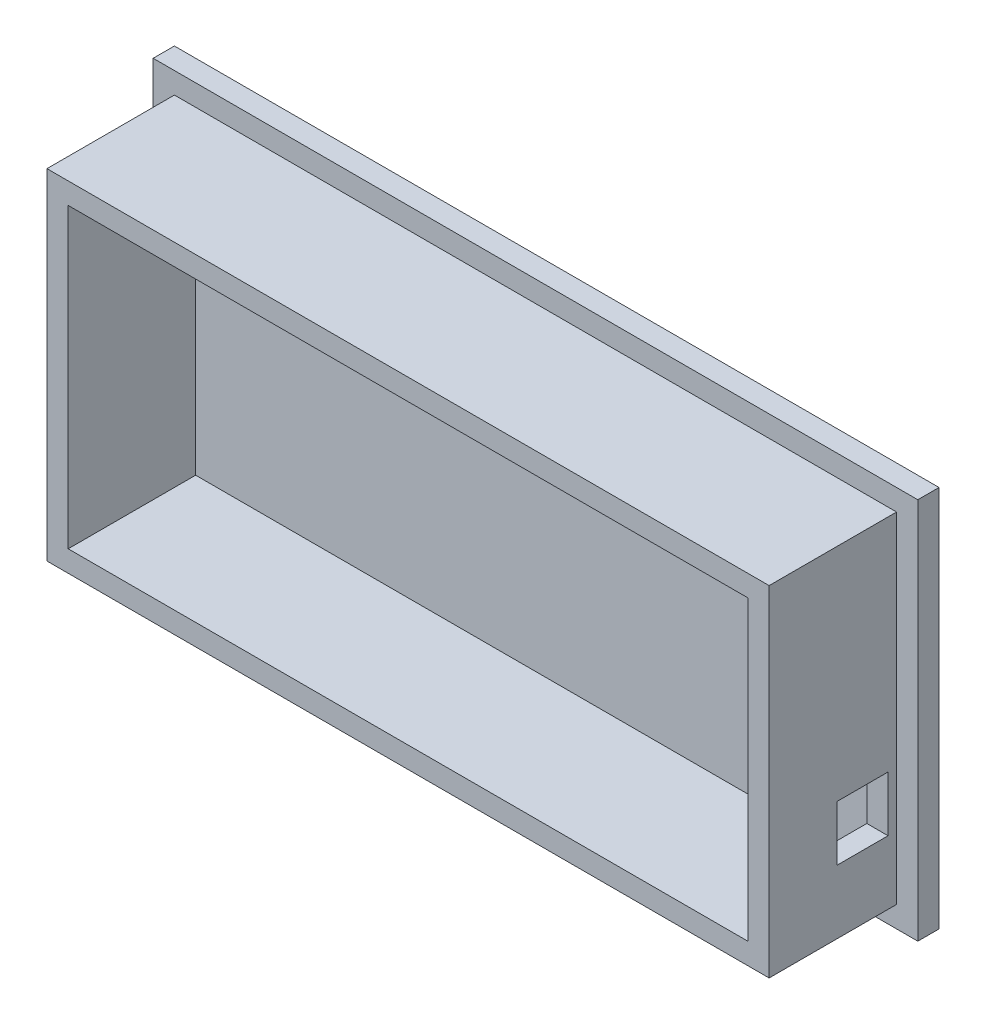
ISO-10303-21;
HEADER;
FILE_DESCRIPTION(('STEP AP214'),'2;1');
FILE_NAME('part.step','',(''),(''),'','','');
FILE_SCHEMA(('AUTOMOTIVE_DESIGN { 1 0 10303 214 1 1 1 1 }'));
ENDSEC;
DATA;
#1=APPLICATION_CONTEXT('core data for automotive mechanical design processes');
#2=APPLICATION_PROTOCOL_DEFINITION('international standard','automotive_design',2000,#1);
#3=PRODUCT_CONTEXT('',#1,'mechanical');
#4=PRODUCT('Part','Part','',(#3));
#5=PRODUCT_RELATED_PRODUCT_CATEGORY('part','',(#4));
#6=PRODUCT_DEFINITION_FORMATION('','',#4);
#7=PRODUCT_DEFINITION_CONTEXT('part definition',#1,'design');
#8=PRODUCT_DEFINITION('design','',#6,#7);
#9=PRODUCT_DEFINITION_SHAPE('','',#8);
#10=(LENGTH_UNIT() NAMED_UNIT(*) SI_UNIT(.MILLI.,.METRE.));
#11=(NAMED_UNIT(*) PLANE_ANGLE_UNIT() SI_UNIT($,.RADIAN.));
#12=(NAMED_UNIT(*) SI_UNIT($,.STERADIAN.) SOLID_ANGLE_UNIT());
#13=UNCERTAINTY_MEASURE_WITH_UNIT(LENGTH_MEASURE(1.E-05),#10,'distance_accuracy_value','');
#14=(GEOMETRIC_REPRESENTATION_CONTEXT(3) GLOBAL_UNCERTAINTY_ASSIGNED_CONTEXT((#13)) GLOBAL_UNIT_ASSIGNED_CONTEXT((#10,
#11,#12)) REPRESENTATION_CONTEXT('',''));
#15=CARTESIAN_POINT('',(0.,0.,0.));
#16=DIRECTION('',(0.,0.,1.));
#17=DIRECTION('',(1.,0.,0.));
#18=AXIS2_PLACEMENT_3D('',#15,#16,#17);
#19=CARTESIAN_POINT('',(0.,0.,5.));
#20=DIRECTION('',(0.,0.,-1.));
#21=DIRECTION('',(-1.,0.,0.));
#22=AXIS2_PLACEMENT_3D('',#19,#20,#21);
#23=PLANE('',#22);
#24=DIRECTION('',(0.,-1.,0.));
#25=VECTOR('',#24,1.);
#26=CARTESIAN_POINT('',(0.,0.,5.));
#27=LINE('',#26,#25);
#28=CARTESIAN_POINT('',(0.,90.,5.));
#29=VERTEX_POINT('',#28);
#30=CARTESIAN_POINT('',(0.,0.,5.));
#31=VERTEX_POINT('',#30);
#32=EDGE_CURVE('E290',#29,#31,#27,.T.);
#33=ORIENTED_EDGE('',*,*,#32,.T.);
#34=DIRECTION('',(1.,0.,0.));
#35=VECTOR('',#34,1.);
#36=CARTESIAN_POINT('',(0.,0.,5.));
#37=LINE('',#36,#35);
#38=CARTESIAN_POINT('',(180.,0.,5.));
#39=VERTEX_POINT('',#38);
#40=EDGE_CURVE('E294',#31,#39,#37,.T.);
#41=ORIENTED_EDGE('',*,*,#40,.T.);
#42=DIRECTION('',(0.,1.,0.));
#43=VECTOR('',#42,1.);
#44=CARTESIAN_POINT('',(180.,0.,5.));
#45=LINE('',#44,#43);
#46=CARTESIAN_POINT('',(180.,90.,5.));
#47=VERTEX_POINT('',#46);
#48=EDGE_CURVE('E298',#39,#47,#45,.T.);
#49=ORIENTED_EDGE('',*,*,#48,.T.);
#50=DIRECTION('',(-1.,0.,0.));
#51=VECTOR('',#50,1.);
#52=CARTESIAN_POINT('',(0.,90.,5.));
#53=LINE('',#52,#51);
#54=EDGE_CURVE('E301',#47,#29,#53,.T.);
#55=ORIENTED_EDGE('',*,*,#54,.T.);
#56=EDGE_LOOP('',(#33,#41,#49,#55));
#57=FACE_BOUND('',#56,.T.);
#58=DIRECTION('',(-1.,0.,0.));
#59=VECTOR('',#58,1.);
#60=CARTESIAN_POINT('',(175.,85.,5.));
#61=LINE('',#60,#59);
#62=CARTESIAN_POINT('',(175.,85.,5.));
#63=VERTEX_POINT('',#62);
#64=CARTESIAN_POINT('',(5.,85.,5.));
#65=VERTEX_POINT('',#64);
#66=EDGE_CURVE('E244',#63,#65,#61,.T.);
#67=ORIENTED_EDGE('',*,*,#66,.F.);
#68=DIRECTION('',(0.,1.,0.));
#69=VECTOR('',#68,1.);
#70=CARTESIAN_POINT('',(175.,5.,5.));
#71=LINE('',#70,#69);
#72=CARTESIAN_POINT('',(175.,5.,5.));
#73=VERTEX_POINT('',#72);
#74=EDGE_CURVE('E250',#73,#63,#71,.T.);
#75=ORIENTED_EDGE('',*,*,#74,.F.);
#76=DIRECTION('',(1.,0.,0.));
#77=VECTOR('',#76,1.);
#78=CARTESIAN_POINT('',(5.,5.,5.));
#79=LINE('',#78,#77);
#80=CARTESIAN_POINT('',(5.,5.,5.));
#81=VERTEX_POINT('',#80);
#82=EDGE_CURVE('E267',#81,#73,#79,.T.);
#83=ORIENTED_EDGE('',*,*,#82,.F.);
#84=DIRECTION('',(0.,-1.,0.));
#85=VECTOR('',#84,1.);
#86=CARTESIAN_POINT('',(5.,85.,5.));
#87=LINE('',#86,#85);
#88=EDGE_CURVE('E263',#65,#81,#87,.T.);
#89=ORIENTED_EDGE('',*,*,#88,.F.);
#90=EDGE_LOOP('',(#67,#75,#83,#89));
#91=FACE_BOUND('',#90,.T.);
#92=ADVANCED_FACE('F42',(#57,#91),#23,.F.);
#93=CARTESIAN_POINT('',(0.,0.,5.));
#94=DIRECTION('',(1.,0.,0.));
#95=DIRECTION('',(0.,0.,-1.));
#96=AXIS2_PLACEMENT_3D('',#93,#94,#95);
#97=PLANE('',#96);
#98=DIRECTION('',(0.,-1.,0.));
#99=VECTOR('',#98,1.);
#100=CARTESIAN_POINT('',(0.,0.,0.));
#101=LINE('',#100,#99);
#102=CARTESIAN_POINT('',(0.,90.,0.));
#103=VERTEX_POINT('',#102);
#104=CARTESIAN_POINT('',(0.,0.,0.));
#105=VERTEX_POINT('',#104);
#106=EDGE_CURVE('E289',#103,#105,#101,.T.);
#107=ORIENTED_EDGE('',*,*,#106,.T.);
#108=DIRECTION('',(0.,0.,-1.));
#109=VECTOR('',#108,1.);
#110=CARTESIAN_POINT('',(0.,0.,5.));
#111=LINE('',#110,#109);
#112=EDGE_CURVE('E11',#31,#105,#111,.T.);
#113=ORIENTED_EDGE('',*,*,#112,.F.);
#114=ORIENTED_EDGE('',*,*,#32,.F.);
#115=DIRECTION('',(0.,0.,-1.));
#116=VECTOR('',#115,1.);
#117=CARTESIAN_POINT('',(0.,90.,5.));
#118=LINE('',#117,#116);
#119=EDGE_CURVE('E304',#29,#103,#118,.T.);
#120=ORIENTED_EDGE('',*,*,#119,.T.);
#121=EDGE_LOOP('',(#107,#113,#114,#120));
#122=FACE_BOUND('',#121,.T.);
#123=ADVANCED_FACE('F44',(#122),#97,.F.);
#124=CARTESIAN_POINT('',(0.,0.,5.));
#125=DIRECTION('',(0.,1.,0.));
#126=DIRECTION('',(0.,0.,1.));
#127=AXIS2_PLACEMENT_3D('',#124,#125,#126);
#128=PLANE('',#127);
#129=DIRECTION('',(1.,0.,0.));
#130=VECTOR('',#129,1.);
#131=CARTESIAN_POINT('',(0.,0.,0.));
#132=LINE('',#131,#130);
#133=CARTESIAN_POINT('',(180.,0.,0.));
#134=VERTEX_POINT('',#133);
#135=EDGE_CURVE('E308',#105,#134,#132,.T.);
#136=ORIENTED_EDGE('',*,*,#135,.T.);
#137=DIRECTION('',(0.,0.,-1.));
#138=VECTOR('',#137,1.);
#139=CARTESIAN_POINT('',(180.,0.,5.));
#140=LINE('',#139,#138);
#141=EDGE_CURVE('E51',#39,#134,#140,.T.);
#142=ORIENTED_EDGE('',*,*,#141,.F.);
#143=ORIENTED_EDGE('',*,*,#40,.F.);
#144=ORIENTED_EDGE('',*,*,#112,.T.);
#145=EDGE_LOOP('',(#136,#142,#143,#144));
#146=FACE_BOUND('',#145,.T.);
#147=ADVANCED_FACE('F344',(#146),#128,.F.);
#148=CARTESIAN_POINT('',(180.,0.,5.));
#149=DIRECTION('',(-1.,0.,0.));
#150=DIRECTION('',(0.,0.,1.));
#151=AXIS2_PLACEMENT_3D('',#148,#149,#150);
#152=PLANE('',#151);
#153=DIRECTION('',(0.,1.,0.));
#154=VECTOR('',#153,1.);
#155=CARTESIAN_POINT('',(180.,0.,0.));
#156=LINE('',#155,#154);
#157=CARTESIAN_POINT('',(180.,90.,0.));
#158=VERTEX_POINT('',#157);
#159=EDGE_CURVE('E311',#134,#158,#156,.T.);
#160=ORIENTED_EDGE('',*,*,#159,.T.);
#161=DIRECTION('',(0.,0.,-1.));
#162=VECTOR('',#161,1.);
#163=CARTESIAN_POINT('',(180.,90.,5.));
#164=LINE('',#163,#162);
#165=EDGE_CURVE('E319',#47,#158,#164,.T.);
#166=ORIENTED_EDGE('',*,*,#165,.F.);
#167=ORIENTED_EDGE('',*,*,#48,.F.);
#168=ORIENTED_EDGE('',*,*,#141,.T.);
#169=EDGE_LOOP('',(#160,#166,#167,#168));
#170=FACE_BOUND('',#169,.T.);
#171=ADVANCED_FACE('F328',(#170),#152,.F.);
#172=CARTESIAN_POINT('',(0.,90.,5.));
#173=DIRECTION('',(0.,-1.,0.));
#174=DIRECTION('',(0.,0.,-1.));
#175=AXIS2_PLACEMENT_3D('',#172,#173,#174);
#176=PLANE('',#175);
#177=DIRECTION('',(-1.,0.,0.));
#178=VECTOR('',#177,1.);
#179=CARTESIAN_POINT('',(0.,90.,0.));
#180=LINE('',#179,#178);
#181=EDGE_CURVE('E295',#158,#103,#180,.T.);
#182=ORIENTED_EDGE('',*,*,#181,.T.);
#183=ORIENTED_EDGE('',*,*,#119,.F.);
#184=ORIENTED_EDGE('',*,*,#54,.F.);
#185=ORIENTED_EDGE('',*,*,#165,.T.);
#186=EDGE_LOOP('',(#182,#183,#184,#185));
#187=FACE_BOUND('',#186,.T.);
#188=ADVANCED_FACE('F337',(#187),#176,.F.);
#189=CARTESIAN_POINT('',(0.,0.,0.));
#190=DIRECTION('',(0.,0.,-1.));
#191=DIRECTION('',(-1.,0.,0.));
#192=AXIS2_PLACEMENT_3D('',#189,#190,#191);
#193=PLANE('',#192);
#194=ORIENTED_EDGE('',*,*,#106,.F.);
#195=ORIENTED_EDGE('',*,*,#181,.F.);
#196=ORIENTED_EDGE('',*,*,#159,.F.);
#197=ORIENTED_EDGE('',*,*,#135,.F.);
#198=EDGE_LOOP('',(#194,#195,#196,#197));
#199=FACE_BOUND('',#198,.T.);
#200=ADVANCED_FACE('F334',(#199),#193,.T.);
#201=CARTESIAN_POINT('',(0.,0.,35.));
#202=DIRECTION('',(0.,0.,1.));
#203=DIRECTION('',(1.,0.,0.));
#204=AXIS2_PLACEMENT_3D('',#201,#202,#203);
#205=PLANE('',#204);
#206=DIRECTION('',(-1.,0.,0.));
#207=VECTOR('',#206,1.);
#208=CARTESIAN_POINT('',(175.,85.,35.));
#209=LINE('',#208,#207);
#210=CARTESIAN_POINT('',(175.,85.,35.));
#211=VERTEX_POINT('',#210);
#212=CARTESIAN_POINT('',(5.,85.,35.));
#213=VERTEX_POINT('',#212);
#214=EDGE_CURVE('E245',#211,#213,#209,.T.);
#215=ORIENTED_EDGE('',*,*,#214,.T.);
#216=DIRECTION('',(0.,-1.,0.));
#217=VECTOR('',#216,1.);
#218=CARTESIAN_POINT('',(5.,85.,35.));
#219=LINE('',#218,#217);
#220=CARTESIAN_POINT('',(5.,5.,35.));
#221=VERTEX_POINT('',#220);
#222=EDGE_CURVE('E249',#213,#221,#219,.T.);
#223=ORIENTED_EDGE('',*,*,#222,.T.);
#224=DIRECTION('',(1.,0.,0.));
#225=VECTOR('',#224,1.);
#226=CARTESIAN_POINT('',(5.,5.,35.));
#227=LINE('',#226,#225);
#228=CARTESIAN_POINT('',(175.,5.,35.));
#229=VERTEX_POINT('',#228);
#230=EDGE_CURVE('E253',#221,#229,#227,.T.);
#231=ORIENTED_EDGE('',*,*,#230,.T.);
#232=DIRECTION('',(0.,1.,0.));
#233=VECTOR('',#232,1.);
#234=CARTESIAN_POINT('',(175.,5.,35.));
#235=LINE('',#234,#233);
#236=EDGE_CURVE('E256',#229,#211,#235,.T.);
#237=ORIENTED_EDGE('',*,*,#236,.T.);
#238=EDGE_LOOP('',(#215,#223,#231,#237));
#239=FACE_BOUND('',#238,.T.);
#240=DIRECTION('',(-1.,0.,0.));
#241=VECTOR('',#240,1.);
#242=CARTESIAN_POINT('',(170.,80.,35.));
#243=LINE('',#242,#241);
#244=CARTESIAN_POINT('',(170.,80.,35.));
#245=VERTEX_POINT('',#244);
#246=CARTESIAN_POINT('',(10.,80.,35.));
#247=VERTEX_POINT('',#246);
#248=EDGE_CURVE('E206',#245,#247,#243,.T.);
#249=ORIENTED_EDGE('',*,*,#248,.F.);
#250=DIRECTION('',(0.,1.,0.));
#251=VECTOR('',#250,1.);
#252=CARTESIAN_POINT('',(170.,10.,35.));
#253=LINE('',#252,#251);
#254=CARTESIAN_POINT('',(170.,10.,35.));
#255=VERTEX_POINT('',#254);
#256=EDGE_CURVE('E203',#255,#245,#253,.T.);
#257=ORIENTED_EDGE('',*,*,#256,.F.);
#258=DIRECTION('',(1.,0.,0.));
#259=VECTOR('',#258,1.);
#260=CARTESIAN_POINT('',(10.,10.,35.));
#261=LINE('',#260,#259);
#262=CARTESIAN_POINT('',(10.,10.,35.));
#263=VERTEX_POINT('',#262);
#264=EDGE_CURVE('E214',#263,#255,#261,.T.);
#265=ORIENTED_EDGE('',*,*,#264,.F.);
#266=DIRECTION('',(0.,-1.,0.));
#267=VECTOR('',#266,1.);
#268=CARTESIAN_POINT('',(10.,80.,35.));
#269=LINE('',#268,#267);
#270=EDGE_CURVE('E210',#247,#263,#269,.T.);
#271=ORIENTED_EDGE('',*,*,#270,.F.);
#272=EDGE_LOOP('',(#249,#257,#265,#271));
#273=FACE_BOUND('',#272,.T.);
#274=ADVANCED_FACE('F382',(#239,#273),#205,.T.);
#275=CARTESIAN_POINT('',(175.,85.,35.));
#276=DIRECTION('',(0.,-1.,0.));
#277=DIRECTION('',(0.,0.,-1.));
#278=AXIS2_PLACEMENT_3D('',#275,#276,#277);
#279=PLANE('',#278);
#280=ORIENTED_EDGE('',*,*,#66,.T.);
#281=DIRECTION('',(0.,0.,-1.));
#282=VECTOR('',#281,1.);
#283=CARTESIAN_POINT('',(5.,85.,35.));
#284=LINE('',#283,#282);
#285=EDGE_CURVE('E285',#213,#65,#284,.T.);
#286=ORIENTED_EDGE('',*,*,#285,.F.);
#287=ORIENTED_EDGE('',*,*,#214,.F.);
#288=DIRECTION('',(0.,0.,-1.));
#289=VECTOR('',#288,1.);
#290=CARTESIAN_POINT('',(175.,85.,35.));
#291=LINE('',#290,#289);
#292=EDGE_CURVE('E259',#211,#63,#291,.T.);
#293=ORIENTED_EDGE('',*,*,#292,.T.);
#294=EDGE_LOOP('',(#280,#286,#287,#293));
#295=FACE_BOUND('',#294,.T.);
#296=ADVANCED_FACE('F396',(#295),#279,.F.);
#297=CARTESIAN_POINT('',(5.,85.,35.));
#298=DIRECTION('',(1.,0.,0.));
#299=DIRECTION('',(0.,0.,-1.));
#300=AXIS2_PLACEMENT_3D('',#297,#298,#299);
#301=PLANE('',#300);
#302=ORIENTED_EDGE('',*,*,#88,.T.);
#303=DIRECTION('',(0.,0.,-1.));
#304=VECTOR('',#303,1.);
#305=CARTESIAN_POINT('',(5.,5.,35.));
#306=LINE('',#305,#304);
#307=EDGE_CURVE('E281',#221,#81,#306,.T.);
#308=ORIENTED_EDGE('',*,*,#307,.F.);
#309=ORIENTED_EDGE('',*,*,#222,.F.);
#310=ORIENTED_EDGE('',*,*,#285,.T.);
#311=EDGE_LOOP('',(#302,#308,#309,#310));
#312=FACE_BOUND('',#311,.T.);
#313=ADVANCED_FACE('F404',(#312),#301,.F.);
#314=CARTESIAN_POINT('',(5.,5.,35.));
#315=DIRECTION('',(0.,1.,0.));
#316=DIRECTION('',(0.,0.,1.));
#317=AXIS2_PLACEMENT_3D('',#314,#315,#316);
#318=PLANE('',#317);
#319=ORIENTED_EDGE('',*,*,#82,.T.);
#320=DIRECTION('',(0.,0.,-1.));
#321=VECTOR('',#320,1.);
#322=CARTESIAN_POINT('',(175.,5.,35.));
#323=LINE('',#322,#321);
#324=EDGE_CURVE('E277',#229,#73,#323,.T.);
#325=ORIENTED_EDGE('',*,*,#324,.F.);
#326=ORIENTED_EDGE('',*,*,#230,.F.);
#327=ORIENTED_EDGE('',*,*,#307,.T.);
#328=EDGE_LOOP('',(#319,#325,#326,#327));
#329=FACE_BOUND('',#328,.T.);
#330=ADVANCED_FACE('F400',(#329),#318,.F.);
#331=CARTESIAN_POINT('',(175.,5.,35.));
#332=DIRECTION('',(-1.,0.,0.));
#333=DIRECTION('',(0.,0.,1.));
#334=AXIS2_PLACEMENT_3D('',#331,#332,#333);
#335=PLANE('',#334);
#336=DIRECTION('',(0.,1.,0.));
#337=VECTOR('',#336,1.);
#338=CARTESIAN_POINT('',(175.,20.,7.));
#339=LINE('',#338,#337);
#340=CARTESIAN_POINT('',(175.,20.,7.));
#341=VERTEX_POINT('',#340);
#342=CARTESIAN_POINT('',(175.,33.,7.));
#343=VERTEX_POINT('',#342);
#344=EDGE_CURVE('E184',#341,#343,#339,.T.);
#345=ORIENTED_EDGE('',*,*,#344,.F.);
#346=DIRECTION('',(0.,0.,-1.));
#347=VECTOR('',#346,1.);
#348=CARTESIAN_POINT('',(175.,20.,19.));
#349=LINE('',#348,#347);
#350=CARTESIAN_POINT('',(175.,20.,19.));
#351=VERTEX_POINT('',#350);
#352=EDGE_CURVE('E174',#351,#341,#349,.T.);
#353=ORIENTED_EDGE('',*,*,#352,.F.);
#354=DIRECTION('',(0.,-1.,0.));
#355=VECTOR('',#354,1.);
#356=CARTESIAN_POINT('',(175.,20.,19.));
#357=LINE('',#356,#355);
#358=CARTESIAN_POINT('',(175.,33.,19.));
#359=VERTEX_POINT('',#358);
#360=EDGE_CURVE('E188',#359,#351,#357,.T.);
#361=ORIENTED_EDGE('',*,*,#360,.F.);
#362=DIRECTION('',(0.,0.,1.));
#363=VECTOR('',#362,1.);
#364=CARTESIAN_POINT('',(175.,33.,19.));
#365=LINE('',#364,#363);
#366=EDGE_CURVE('E58',#343,#359,#365,.T.);
#367=ORIENTED_EDGE('',*,*,#366,.F.);
#368=EDGE_LOOP('',(#345,#353,#361,#367));
#369=FACE_BOUND('',#368,.T.);
#370=ORIENTED_EDGE('',*,*,#74,.T.);
#371=ORIENTED_EDGE('',*,*,#292,.F.);
#372=ORIENTED_EDGE('',*,*,#236,.F.);
#373=ORIENTED_EDGE('',*,*,#324,.T.);
#374=EDGE_LOOP('',(#370,#371,#372,#373));
#375=FACE_BOUND('',#374,.T.);
#376=ADVANCED_FACE('F393',(#369,#375),#335,.F.);
#377=CARTESIAN_POINT('',(170.,10.,35.));
#378=DIRECTION('',(-1.,0.,0.));
#379=DIRECTION('',(0.,0.,1.));
#380=AXIS2_PLACEMENT_3D('',#377,#378,#379);
#381=PLANE('',#380);
#382=DIRECTION('',(0.,0.,-1.));
#383=VECTOR('',#382,1.);
#384=CARTESIAN_POINT('',(170.,20.,19.));
#385=LINE('',#384,#383);
#386=CARTESIAN_POINT('',(170.,20.,19.));
#387=VERTEX_POINT('',#386);
#388=CARTESIAN_POINT('',(170.,20.,7.));
#389=VERTEX_POINT('',#388);
#390=EDGE_CURVE('E171',#387,#389,#385,.T.);
#391=ORIENTED_EDGE('',*,*,#390,.T.);
#392=DIRECTION('',(0.,1.,0.));
#393=VECTOR('',#392,1.);
#394=CARTESIAN_POINT('',(170.,20.,7.));
#395=LINE('',#394,#393);
#396=CARTESIAN_POINT('',(170.,33.,7.));
#397=VERTEX_POINT('',#396);
#398=EDGE_CURVE('E157',#389,#397,#395,.T.);
#399=ORIENTED_EDGE('',*,*,#398,.T.);
#400=DIRECTION('',(0.,0.,1.));
#401=VECTOR('',#400,1.);
#402=CARTESIAN_POINT('',(170.,33.,19.));
#403=LINE('',#402,#401);
#404=CARTESIAN_POINT('',(170.,33.,19.));
#405=VERTEX_POINT('',#404);
#406=EDGE_CURVE('E193',#397,#405,#403,.T.);
#407=ORIENTED_EDGE('',*,*,#406,.T.);
#408=DIRECTION('',(0.,-1.,0.));
#409=VECTOR('',#408,1.);
#410=CARTESIAN_POINT('',(170.,20.,19.));
#411=LINE('',#410,#409);
#412=EDGE_CURVE('E180',#405,#387,#411,.T.);
#413=ORIENTED_EDGE('',*,*,#412,.T.);
#414=EDGE_LOOP('',(#391,#399,#407,#413));
#415=FACE_BOUND('',#414,.T.);
#416=DIRECTION('',(0.,1.,0.));
#417=VECTOR('',#416,1.);
#418=CARTESIAN_POINT('',(170.,10.,5.));
#419=LINE('',#418,#417);
#420=CARTESIAN_POINT('',(170.,10.,5.));
#421=VERTEX_POINT('',#420);
#422=CARTESIAN_POINT('',(170.,80.,5.));
#423=VERTEX_POINT('',#422);
#424=EDGE_CURVE('E202',#421,#423,#419,.T.);
#425=ORIENTED_EDGE('',*,*,#424,.F.);
#426=DIRECTION('',(0.,0.,-1.));
#427=VECTOR('',#426,1.);
#428=CARTESIAN_POINT('',(170.,10.,35.));
#429=LINE('',#428,#427);
#430=EDGE_CURVE('E217',#255,#421,#429,.T.);
#431=ORIENTED_EDGE('',*,*,#430,.F.);
#432=ORIENTED_EDGE('',*,*,#256,.T.);
#433=DIRECTION('',(0.,0.,-1.));
#434=VECTOR('',#433,1.);
#435=CARTESIAN_POINT('',(170.,80.,35.));
#436=LINE('',#435,#434);
#437=EDGE_CURVE('E240',#245,#423,#436,.T.);
#438=ORIENTED_EDGE('',*,*,#437,.T.);
#439=EDGE_LOOP('',(#425,#431,#432,#438));
#440=FACE_BOUND('',#439,.T.);
#441=ADVANCED_FACE('F178',(#415,#440),#381,.T.);
#442=CARTESIAN_POINT('',(170.,80.,35.));
#443=DIRECTION('',(0.,-1.,0.));
#444=DIRECTION('',(0.,0.,-1.));
#445=AXIS2_PLACEMENT_3D('',#442,#443,#444);
#446=PLANE('',#445);
#447=DIRECTION('',(-1.,0.,0.));
#448=VECTOR('',#447,1.);
#449=CARTESIAN_POINT('',(170.,80.,5.));
#450=LINE('',#449,#448);
#451=CARTESIAN_POINT('',(10.,80.,5.));
#452=VERTEX_POINT('',#451);
#453=EDGE_CURVE('E221',#423,#452,#450,.T.);
#454=ORIENTED_EDGE('',*,*,#453,.F.);
#455=ORIENTED_EDGE('',*,*,#437,.F.);
#456=ORIENTED_EDGE('',*,*,#248,.T.);
#457=DIRECTION('',(0.,0.,-1.));
#458=VECTOR('',#457,1.);
#459=CARTESIAN_POINT('',(10.,80.,35.));
#460=LINE('',#459,#458);
#461=EDGE_CURVE('E237',#247,#452,#460,.T.);
#462=ORIENTED_EDGE('',*,*,#461,.T.);
#463=EDGE_LOOP('',(#454,#455,#456,#462));
#464=FACE_BOUND('',#463,.T.);
#465=ADVANCED_FACE('F378',(#464),#446,.T.);
#466=CARTESIAN_POINT('',(10.,80.,35.));
#467=DIRECTION('',(1.,0.,0.));
#468=DIRECTION('',(0.,0.,-1.));
#469=AXIS2_PLACEMENT_3D('',#466,#467,#468);
#470=PLANE('',#469);
#471=DIRECTION('',(0.,-1.,0.));
#472=VECTOR('',#471,1.);
#473=CARTESIAN_POINT('',(10.,80.,5.));
#474=LINE('',#473,#472);
#475=CARTESIAN_POINT('',(10.,10.,5.));
#476=VERTEX_POINT('',#475);
#477=EDGE_CURVE('E225',#452,#476,#474,.T.);
#478=ORIENTED_EDGE('',*,*,#477,.F.);
#479=ORIENTED_EDGE('',*,*,#461,.F.);
#480=ORIENTED_EDGE('',*,*,#270,.T.);
#481=DIRECTION('',(0.,0.,-1.));
#482=VECTOR('',#481,1.);
#483=CARTESIAN_POINT('',(10.,10.,35.));
#484=LINE('',#483,#482);
#485=EDGE_CURVE('E234',#263,#476,#484,.T.);
#486=ORIENTED_EDGE('',*,*,#485,.T.);
#487=EDGE_LOOP('',(#478,#479,#480,#486));
#488=FACE_BOUND('',#487,.T.);
#489=ADVANCED_FACE('F366',(#488),#470,.T.);
#490=CARTESIAN_POINT('',(10.,10.,35.));
#491=DIRECTION('',(0.,1.,0.));
#492=DIRECTION('',(0.,0.,1.));
#493=AXIS2_PLACEMENT_3D('',#490,#491,#492);
#494=PLANE('',#493);
#495=DIRECTION('',(1.,0.,0.));
#496=VECTOR('',#495,1.);
#497=CARTESIAN_POINT('',(10.,10.,5.));
#498=LINE('',#497,#496);
#499=EDGE_CURVE('E207',#476,#421,#498,.T.);
#500=ORIENTED_EDGE('',*,*,#499,.F.);
#501=ORIENTED_EDGE('',*,*,#485,.F.);
#502=ORIENTED_EDGE('',*,*,#264,.T.);
#503=ORIENTED_EDGE('',*,*,#430,.T.);
#504=EDGE_LOOP('',(#500,#501,#502,#503));
#505=FACE_BOUND('',#504,.T.);
#506=ADVANCED_FACE('F359',(#505),#494,.T.);
#507=ORIENTED_EDGE('',*,*,#499,.T.);
#508=ORIENTED_EDGE('',*,*,#424,.T.);
#509=ORIENTED_EDGE('',*,*,#453,.T.);
#510=ORIENTED_EDGE('',*,*,#477,.T.);
#511=EDGE_LOOP('',(#507,#508,#509,#510));
#512=FACE_BOUND('',#511,.T.);
#513=ADVANCED_FACE('F353',(#512),#23,.F.);
#514=CARTESIAN_POINT('',(152.308193987046,20.,19.));
#515=DIRECTION('',(0.,-1.,0.));
#516=DIRECTION('',(0.,0.,-1.));
#517=AXIS2_PLACEMENT_3D('',#514,#515,#516);
#518=PLANE('',#517);
#519=DIRECTION('',(1.,0.,0.));
#520=VECTOR('',#519,1.);
#521=CARTESIAN_POINT('',(152.308193987046,20.,19.));
#522=LINE('',#521,#520);
#523=EDGE_CURVE('E66',#387,#351,#522,.T.);
#524=ORIENTED_EDGE('',*,*,#523,.T.);
#525=ORIENTED_EDGE('',*,*,#352,.T.);
#526=DIRECTION('',(1.,0.,0.));
#527=VECTOR('',#526,1.);
#528=CARTESIAN_POINT('',(152.308193987046,20.,7.));
#529=LINE('',#528,#527);
#530=EDGE_CURVE('E161',#389,#341,#529,.T.);
#531=ORIENTED_EDGE('',*,*,#530,.F.);
#532=ORIENTED_EDGE('',*,*,#390,.F.);
#533=EDGE_LOOP('',(#524,#525,#531,#532));
#534=FACE_BOUND('',#533,.T.);
#535=ADVANCED_FACE('F170',(#534),#518,.F.);
#536=CARTESIAN_POINT('',(152.308193987046,20.,7.));
#537=DIRECTION('',(0.,0.,-1.));
#538=DIRECTION('',(0.,1.,0.));
#539=AXIS2_PLACEMENT_3D('',#536,#537,#538);
#540=PLANE('',#539);
#541=ORIENTED_EDGE('',*,*,#530,.T.);
#542=ORIENTED_EDGE('',*,*,#344,.T.);
#543=DIRECTION('',(1.,0.,0.));
#544=VECTOR('',#543,1.);
#545=CARTESIAN_POINT('',(152.308193987046,33.,7.));
#546=LINE('',#545,#544);
#547=EDGE_CURVE('E163',#397,#343,#546,.T.);
#548=ORIENTED_EDGE('',*,*,#547,.F.);
#549=ORIENTED_EDGE('',*,*,#398,.F.);
#550=EDGE_LOOP('',(#541,#542,#548,#549));
#551=FACE_BOUND('',#550,.T.);
#552=ADVANCED_FACE('F159',(#551),#540,.F.);
#553=CARTESIAN_POINT('',(152.308193987046,33.,19.));
#554=DIRECTION('',(0.,1.,0.));
#555=DIRECTION('',(0.,0.,1.));
#556=AXIS2_PLACEMENT_3D('',#553,#554,#555);
#557=PLANE('',#556);
#558=ORIENTED_EDGE('',*,*,#547,.T.);
#559=ORIENTED_EDGE('',*,*,#366,.T.);
#560=DIRECTION('',(1.,0.,0.));
#561=VECTOR('',#560,1.);
#562=CARTESIAN_POINT('',(152.308193987046,33.,19.));
#563=LINE('',#562,#561);
#564=EDGE_CURVE('E192',#405,#359,#563,.T.);
#565=ORIENTED_EDGE('',*,*,#564,.F.);
#566=ORIENTED_EDGE('',*,*,#406,.F.);
#567=EDGE_LOOP('',(#558,#559,#565,#566));
#568=FACE_BOUND('',#567,.T.);
#569=ADVANCED_FACE('F525',(#568),#557,.F.);
#570=CARTESIAN_POINT('',(152.308193987046,20.,19.));
#571=DIRECTION('',(0.,0.,1.));
#572=DIRECTION('',(1.,0.,0.));
#573=AXIS2_PLACEMENT_3D('',#570,#571,#572);
#574=PLANE('',#573);
#575=ORIENTED_EDGE('',*,*,#564,.T.);
#576=ORIENTED_EDGE('',*,*,#360,.T.);
#577=ORIENTED_EDGE('',*,*,#523,.F.);
#578=ORIENTED_EDGE('',*,*,#412,.F.);
#579=EDGE_LOOP('',(#575,#576,#577,#578));
#580=FACE_BOUND('',#579,.T.);
#581=ADVANCED_FACE('F534',(#580),#574,.F.);
#582=CLOSED_SHELL('',(#92,#123,#147,#171,#188,#200,#274,#296,#313,#330,#376,#441,#465,#489,#506,
#513,#535,#552,#569,#581));
#583=MANIFOLD_SOLID_BREP('B2',#582);
#584=ADVANCED_BREP_SHAPE_REPRESENTATION('',(#18,#583),#14);
#585=SHAPE_DEFINITION_REPRESENTATION(#9,#584);
ENDSEC;
END-ISO-10303-21;
